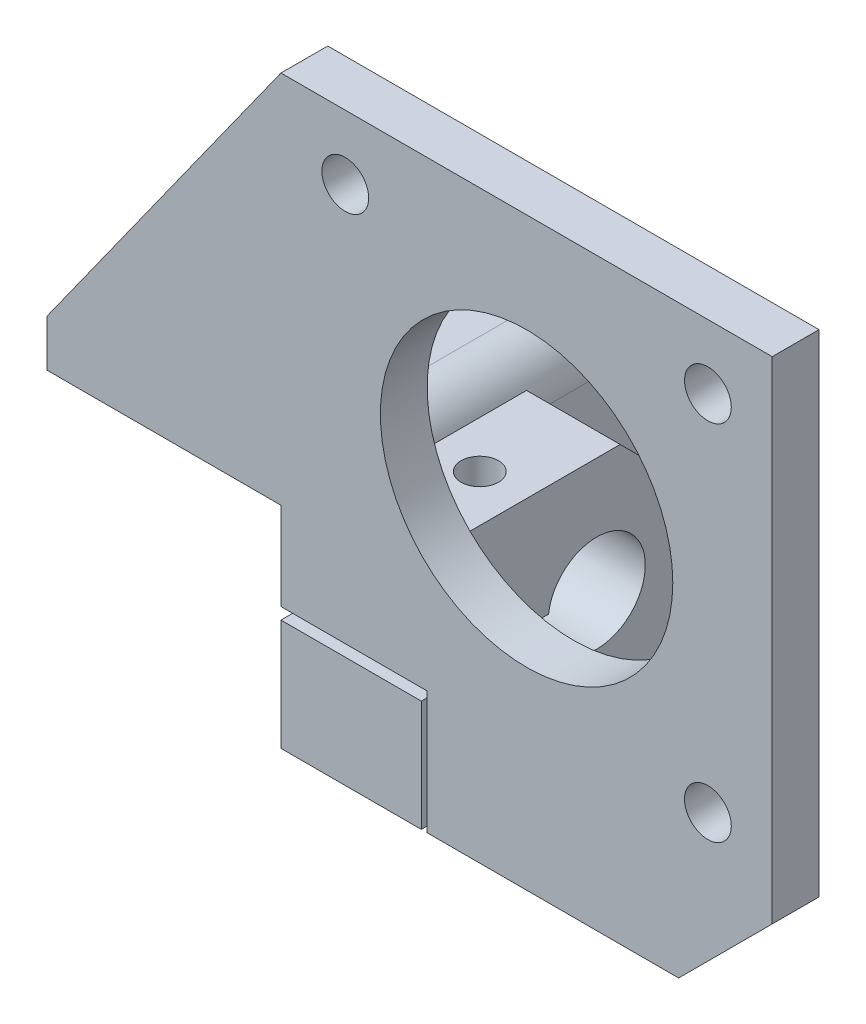
ISO-10303-21;
HEADER;
FILE_DESCRIPTION(('STEP AP214'),'2;1');
FILE_NAME('part.step','',(''),(''),'','','');
FILE_SCHEMA(('AUTOMOTIVE_DESIGN { 1 0 10303 214 1 1 1 1 }'));
ENDSEC;
DATA;
#1=APPLICATION_CONTEXT('core data for automotive mechanical design processes');
#2=APPLICATION_PROTOCOL_DEFINITION('international standard','automotive_design',2000,#1);
#3=PRODUCT_CONTEXT('',#1,'mechanical');
#4=PRODUCT('Part','Part','',(#3));
#5=PRODUCT_RELATED_PRODUCT_CATEGORY('part','',(#4));
#6=PRODUCT_DEFINITION_FORMATION('','',#4);
#7=PRODUCT_DEFINITION_CONTEXT('part definition',#1,'design');
#8=PRODUCT_DEFINITION('design','',#6,#7);
#9=PRODUCT_DEFINITION_SHAPE('','',#8);
#10=(LENGTH_UNIT() NAMED_UNIT(*) SI_UNIT(.MILLI.,.METRE.));
#11=(NAMED_UNIT(*) PLANE_ANGLE_UNIT() SI_UNIT($,.RADIAN.));
#12=(NAMED_UNIT(*) SI_UNIT($,.STERADIAN.) SOLID_ANGLE_UNIT());
#13=UNCERTAINTY_MEASURE_WITH_UNIT(LENGTH_MEASURE(1.E-05),#10,'distance_accuracy_value','');
#14=(GEOMETRIC_REPRESENTATION_CONTEXT(3) GLOBAL_UNCERTAINTY_ASSIGNED_CONTEXT((#13)) GLOBAL_UNIT_ASSIGNED_CONTEXT((#10,
#11,#12)) REPRESENTATION_CONTEXT('',''));
#15=CARTESIAN_POINT('',(0.,0.,0.));
#16=DIRECTION('',(0.,0.,1.));
#17=DIRECTION('',(1.,0.,0.));
#18=AXIS2_PLACEMENT_3D('',#15,#16,#17);
#19=CARTESIAN_POINT('',(0.,0.,0.));
#20=DIRECTION('',(0.,0.,-1.));
#21=DIRECTION('',(-1.,0.,0.));
#22=AXIS2_PLACEMENT_3D('',#19,#20,#21);
#23=PLANE('',#22);
#24=CARTESIAN_POINT('',(15.5,-15.5,0.));
#25=DIRECTION('',(0.,0.,1.));
#26=DIRECTION('',(1.,0.,0.));
#27=AXIS2_PLACEMENT_3D('',#24,#25,#26);
#28=CIRCLE('',#27,2.);
#29=CARTESIAN_POINT('',(17.5,-15.5,0.));
#30=VERTEX_POINT('',#29);
#31=EDGE_CURVE('E318',#30,#30,#28,.T.);
#32=ORIENTED_EDGE('',*,*,#31,.T.);
#33=EDGE_LOOP('',(#32));
#34=FACE_BOUND('',#33,.T.);
#35=CARTESIAN_POINT('',(-15.5,15.5,0.));
#36=DIRECTION('',(0.,0.,1.));
#37=DIRECTION('',(1.,0.,0.));
#38=AXIS2_PLACEMENT_3D('',#35,#36,#37);
#39=CIRCLE('',#38,2.);
#40=CARTESIAN_POINT('',(-13.5,15.5,0.));
#41=VERTEX_POINT('',#40);
#42=EDGE_CURVE('E330',#41,#41,#39,.T.);
#43=ORIENTED_EDGE('',*,*,#42,.T.);
#44=EDGE_LOOP('',(#43));
#45=FACE_BOUND('',#44,.T.);
#46=CARTESIAN_POINT('',(15.5,15.5,0.));
#47=DIRECTION('',(0.,0.,1.));
#48=DIRECTION('',(1.,0.,0.));
#49=AXIS2_PLACEMENT_3D('',#46,#47,#48);
#50=CIRCLE('',#49,2.);
#51=CARTESIAN_POINT('',(17.5,15.5,0.));
#52=VERTEX_POINT('',#51);
#53=EDGE_CURVE('E324',#52,#52,#50,.T.);
#54=ORIENTED_EDGE('',*,*,#53,.T.);
#55=EDGE_LOOP('',(#54));
#56=FACE_BOUND('',#55,.T.);
#57=CARTESIAN_POINT('',(0.,0.,0.));
#58=DIRECTION('',(0.,0.,1.));
#59=DIRECTION('',(1.,0.,0.));
#60=AXIS2_PLACEMENT_3D('',#57,#58,#59);
#61=CIRCLE('',#60,12.5);
#62=CARTESIAN_POINT('',(12.5,0.,0.));
#63=VERTEX_POINT('',#62);
#64=EDGE_CURVE('E314',#63,#63,#61,.T.);
#65=ORIENTED_EDGE('',*,*,#64,.T.);
#66=EDGE_LOOP('',(#65));
#67=FACE_BOUND('',#66,.T.);
#68=DIRECTION('',(1.,0.,0.));
#69=VECTOR('',#68,1.);
#70=CARTESIAN_POINT('',(-21.,-29.,0.));
#71=LINE('',#70,#69);
#72=CARTESIAN_POINT('',(-8.49999999999999,-29.,0.));
#73=VERTEX_POINT('',#72);
#74=CARTESIAN_POINT('',(13.,-29.,0.));
#75=VERTEX_POINT('',#74);
#76=EDGE_CURVE('E343',#73,#75,#71,.T.);
#77=ORIENTED_EDGE('',*,*,#76,.F.);
#78=DIRECTION('',(0.,1.,0.));
#79=VECTOR('',#78,1.);
#80=CARTESIAN_POINT('',(-8.49999999999998,0.,0.));
#81=LINE('',#80,#79);
#82=CARTESIAN_POINT('',(-8.49999999999999,-18.5,0.));
#83=VERTEX_POINT('',#82);
#84=EDGE_CURVE('E237',#73,#83,#81,.T.);
#85=ORIENTED_EDGE('',*,*,#84,.T.);
#86=DIRECTION('',(-1.,0.,0.));
#87=VECTOR('',#86,1.);
#88=CARTESIAN_POINT('',(0.,-18.5,0.));
#89=LINE('',#88,#87);
#90=CARTESIAN_POINT('',(-8.99999999999999,-18.5,0.));
#91=VERTEX_POINT('',#90);
#92=EDGE_CURVE('E221',#83,#91,#89,.T.);
#93=ORIENTED_EDGE('',*,*,#92,.T.);
#94=DIRECTION('',(0.,-1.,0.));
#95=VECTOR('',#94,1.);
#96=CARTESIAN_POINT('',(-8.99999999999999,-29.,0.));
#97=LINE('',#96,#95);
#98=CARTESIAN_POINT('',(-8.99999999999998,-9.00000000000001,0.));
#99=VERTEX_POINT('',#98);
#100=EDGE_CURVE('E57',#99,#91,#97,.T.);
#101=ORIENTED_EDGE('',*,*,#100,.F.);
#102=DIRECTION('',(-1.,0.,0.));
#103=VECTOR('',#102,1.);
#104=CARTESIAN_POINT('',(-8.99999999999998,-9.00000000000001,0.));
#105=LINE('',#104,#103);
#106=CARTESIAN_POINT('',(-17.,-9.00000000000001,0.));
#107=VERTEX_POINT('',#106);
#108=EDGE_CURVE('E52',#99,#107,#105,.T.);
#109=ORIENTED_EDGE('',*,*,#108,.T.);
#110=DIRECTION('',(0.,-1.,0.));
#111=VECTOR('',#110,1.);
#112=CARTESIAN_POINT('',(-17.,-29.,0.));
#113=LINE('',#112,#111);
#114=CARTESIAN_POINT('',(-17.,-11.,0.));
#115=VERTEX_POINT('',#114);
#116=EDGE_CURVE('E241',#107,#115,#113,.T.);
#117=ORIENTED_EDGE('',*,*,#116,.T.);
#118=CARTESIAN_POINT('',(-21.,-11.,0.));
#119=DIRECTION('',(0.,0.,-1.));
#120=DIRECTION('',(-1.,0.,0.));
#121=AXIS2_PLACEMENT_3D('',#118,#119,#120);
#122=CIRCLE('',#121,4.);
#123=CARTESIAN_POINT('',(-21.,-7.00000000000001,0.));
#124=VERTEX_POINT('',#123);
#125=EDGE_CURVE('E284',#124,#115,#122,.T.);
#126=ORIENTED_EDGE('',*,*,#125,.F.);
#127=DIRECTION('',(1.,0.,0.));
#128=VECTOR('',#127,1.);
#129=CARTESIAN_POINT('',(-41.,-7.00000000000001,0.));
#130=LINE('',#129,#128);
#131=CARTESIAN_POINT('',(-41.,-7.00000000000001,0.));
#132=VERTEX_POINT('',#131);
#133=EDGE_CURVE('E279',#132,#124,#130,.T.);
#134=ORIENTED_EDGE('',*,*,#133,.F.);
#135=DIRECTION('',(-0.581238193719096,-0.813733471206735,0.));
#136=VECTOR('',#135,1.);
#137=CARTESIAN_POINT('',(-41.,-7.00000000000001,0.));
#138=LINE('',#137,#136);
#139=CARTESIAN_POINT('',(-21.,21.,0.));
#140=VERTEX_POINT('',#139);
#141=EDGE_CURVE('E367',#140,#132,#138,.T.);
#142=ORIENTED_EDGE('',*,*,#141,.F.);
#143=DIRECTION('',(-1.,0.,0.));
#144=VECTOR('',#143,1.);
#145=CARTESIAN_POINT('',(-21.,21.,0.));
#146=LINE('',#145,#144);
#147=CARTESIAN_POINT('',(21.,21.,0.));
#148=VERTEX_POINT('',#147);
#149=EDGE_CURVE('E365',#148,#140,#146,.T.);
#150=ORIENTED_EDGE('',*,*,#149,.F.);
#151=DIRECTION('',(0.,1.,0.));
#152=VECTOR('',#151,1.);
#153=CARTESIAN_POINT('',(21.,21.,0.));
#154=LINE('',#153,#152);
#155=CARTESIAN_POINT('',(21.,-21.,0.));
#156=VERTEX_POINT('',#155);
#157=EDGE_CURVE('E363',#156,#148,#154,.T.);
#158=ORIENTED_EDGE('',*,*,#157,.F.);
#159=DIRECTION('',(0.707106781186546,0.707106781186549,0.));
#160=VECTOR('',#159,1.);
#161=CARTESIAN_POINT('',(13.,-29.,0.));
#162=LINE('',#161,#160);
#163=EDGE_CURVE('E336',#75,#156,#162,.T.);
#164=ORIENTED_EDGE('',*,*,#163,.F.);
#165=EDGE_LOOP('',(#77,#85,#93,#101,#109,#117,#126,#134,#142,#150,#158,#164));
#166=FACE_BOUND('',#165,.T.);
#167=ADVANCED_FACE('F35',(#34,#45,#56,#67,#166),#23,.T.);
#168=CARTESIAN_POINT('',(0.,0.,4.));
#169=DIRECTION('',(0.,0.,-1.));
#170=DIRECTION('',(-1.,0.,0.));
#171=AXIS2_PLACEMENT_3D('',#168,#169,#170);
#172=PLANE('',#171);
#173=DIRECTION('',(0.,-1.,0.));
#174=VECTOR('',#173,1.);
#175=CARTESIAN_POINT('',(-8.99999999999998,0.,4.));
#176=LINE('',#175,#174);
#177=CARTESIAN_POINT('',(-8.99999999999999,-19.5,4.));
#178=VERTEX_POINT('',#177);
#179=CARTESIAN_POINT('',(-8.99999999999999,-29.,4.));
#180=VERTEX_POINT('',#179);
#181=EDGE_CURVE('E232',#178,#180,#176,.T.);
#182=ORIENTED_EDGE('',*,*,#181,.F.);
#183=DIRECTION('',(1.,0.,0.));
#184=VECTOR('',#183,1.);
#185=CARTESIAN_POINT('',(0.,-19.5,4.));
#186=LINE('',#185,#184);
#187=CARTESIAN_POINT('',(-21.,-19.5,4.));
#188=VERTEX_POINT('',#187);
#189=EDGE_CURVE('E229',#188,#178,#186,.T.);
#190=ORIENTED_EDGE('',*,*,#189,.F.);
#191=DIRECTION('',(0.,-1.,0.));
#192=VECTOR('',#191,1.);
#193=CARTESIAN_POINT('',(-21.,-11.,4.));
#194=LINE('',#193,#192);
#195=CARTESIAN_POINT('',(-21.,-29.,4.));
#196=VERTEX_POINT('',#195);
#197=EDGE_CURVE('E353',#188,#196,#194,.T.);
#198=ORIENTED_EDGE('',*,*,#197,.T.);
#199=DIRECTION('',(1.,0.,0.));
#200=VECTOR('',#199,1.);
#201=CARTESIAN_POINT('',(-21.,-29.,4.));
#202=LINE('',#201,#200);
#203=EDGE_CURVE('E357',#196,#180,#202,.T.);
#204=ORIENTED_EDGE('',*,*,#203,.T.);
#205=EDGE_LOOP('',(#182,#190,#198,#204));
#206=FACE_BOUND('',#205,.T.);
#207=ADVANCED_FACE('F494',(#206),#172,.F.);
#208=CARTESIAN_POINT('',(0.,0.,4.));
#209=DIRECTION('',(0.,0.,1.));
#210=DIRECTION('',(1.,0.,0.));
#211=AXIS2_PLACEMENT_3D('',#208,#209,#210);
#212=CIRCLE('',#211,12.5);
#213=CARTESIAN_POINT('',(12.5,0.,4.));
#214=VERTEX_POINT('',#213);
#215=EDGE_CURVE('E315',#214,#214,#212,.T.);
#216=ORIENTED_EDGE('',*,*,#215,.F.);
#217=EDGE_LOOP('',(#216));
#218=FACE_BOUND('',#217,.T.);
#219=CARTESIAN_POINT('',(15.5,-15.5,4.));
#220=DIRECTION('',(0.,0.,1.));
#221=DIRECTION('',(1.,0.,0.));
#222=AXIS2_PLACEMENT_3D('',#219,#220,#221);
#223=CIRCLE('',#222,2.);
#224=CARTESIAN_POINT('',(17.5,-15.5,4.));
#225=VERTEX_POINT('',#224);
#226=EDGE_CURVE('E321',#225,#225,#223,.T.);
#227=ORIENTED_EDGE('',*,*,#226,.F.);
#228=EDGE_LOOP('',(#227));
#229=FACE_BOUND('',#228,.T.);
#230=CARTESIAN_POINT('',(15.5,15.5,4.));
#231=DIRECTION('',(0.,0.,1.));
#232=DIRECTION('',(1.,0.,0.));
#233=AXIS2_PLACEMENT_3D('',#230,#231,#232);
#234=CIRCLE('',#233,2.);
#235=CARTESIAN_POINT('',(17.5,15.5,4.));
#236=VERTEX_POINT('',#235);
#237=EDGE_CURVE('E327',#236,#236,#234,.T.);
#238=ORIENTED_EDGE('',*,*,#237,.F.);
#239=EDGE_LOOP('',(#238));
#240=FACE_BOUND('',#239,.T.);
#241=CARTESIAN_POINT('',(-15.5,15.5,4.));
#242=DIRECTION('',(0.,0.,1.));
#243=DIRECTION('',(1.,0.,0.));
#244=AXIS2_PLACEMENT_3D('',#241,#242,#243);
#245=CIRCLE('',#244,2.);
#246=CARTESIAN_POINT('',(-13.5,15.5,4.));
#247=VERTEX_POINT('',#246);
#248=EDGE_CURVE('E333',#247,#247,#245,.T.);
#249=ORIENTED_EDGE('',*,*,#248,.F.);
#250=EDGE_LOOP('',(#249));
#251=FACE_BOUND('',#250,.T.);
#252=DIRECTION('',(0.,1.,0.));
#253=VECTOR('',#252,1.);
#254=CARTESIAN_POINT('',(-8.49999999999998,0.,4.));
#255=LINE('',#254,#253);
#256=CARTESIAN_POINT('',(-8.49999999999999,-29.,4.));
#257=VERTEX_POINT('',#256);
#258=CARTESIAN_POINT('',(-8.49999999999999,-18.5,4.));
#259=VERTEX_POINT('',#258);
#260=EDGE_CURVE('E235',#257,#259,#255,.T.);
#261=ORIENTED_EDGE('',*,*,#260,.F.);
#262=CARTESIAN_POINT('',(13.,-29.,4.));
#263=VERTEX_POINT('',#262);
#264=EDGE_CURVE('E356',#257,#263,#202,.T.);
#265=ORIENTED_EDGE('',*,*,#264,.T.);
#266=DIRECTION('',(0.707106781186546,0.707106781186549,0.));
#267=VECTOR('',#266,1.);
#268=CARTESIAN_POINT('',(13.,-29.,4.));
#269=LINE('',#268,#267);
#270=CARTESIAN_POINT('',(21.,-21.,4.));
#271=VERTEX_POINT('',#270);
#272=EDGE_CURVE('E339',#263,#271,#269,.T.);
#273=ORIENTED_EDGE('',*,*,#272,.T.);
#274=DIRECTION('',(0.,1.,0.));
#275=VECTOR('',#274,1.);
#276=CARTESIAN_POINT('',(21.,21.,4.));
#277=LINE('',#276,#275);
#278=CARTESIAN_POINT('',(21.,21.,4.));
#279=VERTEX_POINT('',#278);
#280=EDGE_CURVE('E342',#271,#279,#277,.T.);
#281=ORIENTED_EDGE('',*,*,#280,.T.);
#282=DIRECTION('',(-1.,0.,0.));
#283=VECTOR('',#282,1.);
#284=CARTESIAN_POINT('',(-21.,21.,4.));
#285=LINE('',#284,#283);
#286=CARTESIAN_POINT('',(-21.,21.,4.));
#287=VERTEX_POINT('',#286);
#288=EDGE_CURVE('E345',#279,#287,#285,.T.);
#289=ORIENTED_EDGE('',*,*,#288,.T.);
#290=DIRECTION('',(-0.581238193719096,-0.813733471206735,0.));
#291=VECTOR('',#290,1.);
#292=CARTESIAN_POINT('',(-41.,-7.00000000000001,4.));
#293=LINE('',#292,#291);
#294=CARTESIAN_POINT('',(-41.,-7.00000000000001,4.));
#295=VERTEX_POINT('',#294);
#296=EDGE_CURVE('E347',#287,#295,#293,.T.);
#297=ORIENTED_EDGE('',*,*,#296,.T.);
#298=DIRECTION('',(0.,-1.,0.));
#299=VECTOR('',#298,1.);
#300=CARTESIAN_POINT('',(-41.,-11.,4.));
#301=LINE('',#300,#299);
#302=CARTESIAN_POINT('',(-41.,-11.,4.));
#303=VERTEX_POINT('',#302);
#304=EDGE_CURVE('E349',#295,#303,#301,.T.);
#305=ORIENTED_EDGE('',*,*,#304,.T.);
#306=DIRECTION('',(1.,0.,0.));
#307=VECTOR('',#306,1.);
#308=CARTESIAN_POINT('',(-21.,-11.,4.));
#309=LINE('',#308,#307);
#310=CARTESIAN_POINT('',(-21.,-11.,4.));
#311=VERTEX_POINT('',#310);
#312=EDGE_CURVE('E351',#303,#311,#309,.T.);
#313=ORIENTED_EDGE('',*,*,#312,.T.);
#314=CARTESIAN_POINT('',(-21.,-18.5,4.));
#315=VERTEX_POINT('',#314);
#316=EDGE_CURVE('E354',#311,#315,#194,.T.);
#317=ORIENTED_EDGE('',*,*,#316,.T.);
#318=DIRECTION('',(-1.,0.,0.));
#319=VECTOR('',#318,1.);
#320=CARTESIAN_POINT('',(0.,-18.5,4.));
#321=LINE('',#320,#319);
#322=EDGE_CURVE('E220',#259,#315,#321,.T.);
#323=ORIENTED_EDGE('',*,*,#322,.F.);
#324=EDGE_LOOP('',(#261,#265,#273,#281,#289,#297,#305,#313,#317,#323));
#325=FACE_BOUND('',#324,.T.);
#326=ADVANCED_FACE('F456',(#218,#229,#240,#251,#325),#172,.F.);
#327=CARTESIAN_POINT('',(-21.,-21.,4.));
#328=DIRECTION('',(1.,0.,0.));
#329=DIRECTION('',(0.,1.,0.));
#330=AXIS2_PLACEMENT_3D('',#327,#328,#329);
#331=PLANE('',#330);
#332=CARTESIAN_POINT('',(-21.,-21.,-21.));
#333=DIRECTION('',(1.,0.,0.));
#334=DIRECTION('',(0.,1.,0.));
#335=AXIS2_PLACEMENT_3D('',#332,#333,#334);
#336=CIRCLE('',#335,1.75);
#337=CARTESIAN_POINT('',(-21.,-19.25,-21.));
#338=VERTEX_POINT('',#337);
#339=EDGE_CURVE('E408',#338,#338,#336,.T.);
#340=ORIENTED_EDGE('',*,*,#339,.T.);
#341=EDGE_LOOP('',(#340));
#342=FACE_BOUND('',#341,.T.);
#343=DIRECTION('',(0.,0.,1.));
#344=VECTOR('',#343,1.);
#345=CARTESIAN_POINT('',(-21.,-19.5,-8.));
#346=LINE('',#345,#344);
#347=CARTESIAN_POINT('',(-21.,-19.5,-6.8802305889771));
#348=VERTEX_POINT('',#347);
#349=EDGE_CURVE('E213',#348,#188,#346,.T.);
#350=ORIENTED_EDGE('',*,*,#349,.F.);
#351=CARTESIAN_POINT('',(-21.,-19.,-11.));
#352=DIRECTION('',(1.,0.,0.));
#353=DIRECTION('',(0.,1.,0.));
#354=AXIS2_PLACEMENT_3D('',#351,#352,#353);
#355=CIRCLE('',#354,4.15);
#356=CARTESIAN_POINT('',(-21.,-18.5,-6.8802305889771));
#357=VERTEX_POINT('',#356);
#358=EDGE_CURVE('E196',#348,#357,#355,.T.);
#359=ORIENTED_EDGE('',*,*,#358,.T.);
#360=DIRECTION('',(0.,0.,-1.));
#361=VECTOR('',#360,1.);
#362=CARTESIAN_POINT('',(-21.,-18.5,4.));
#363=LINE('',#362,#361);
#364=EDGE_CURVE('E210',#315,#357,#363,.T.);
#365=ORIENTED_EDGE('',*,*,#364,.F.);
#366=ORIENTED_EDGE('',*,*,#316,.F.);
#367=DIRECTION('',(0.,0.,-1.));
#368=VECTOR('',#367,1.);
#369=CARTESIAN_POINT('',(-21.,-11.,4.));
#370=LINE('',#369,#368);
#371=CARTESIAN_POINT('',(-21.,-11.,-25.));
#372=VERTEX_POINT('',#371);
#373=EDGE_CURVE('E375',#311,#372,#370,.T.);
#374=ORIENTED_EDGE('',*,*,#373,.T.);
#375=DIRECTION('',(0.,1.,0.));
#376=VECTOR('',#375,1.);
#377=CARTESIAN_POINT('',(-21.,-29.,-25.));
#378=LINE('',#377,#376);
#379=CARTESIAN_POINT('',(-21.,-29.,-25.));
#380=VERTEX_POINT('',#379);
#381=EDGE_CURVE('E295',#380,#372,#378,.T.);
#382=ORIENTED_EDGE('',*,*,#381,.F.);
#383=DIRECTION('',(0.,0.,-1.));
#384=VECTOR('',#383,1.);
#385=CARTESIAN_POINT('',(-21.,-29.,4.));
#386=LINE('',#385,#384);
#387=EDGE_CURVE('E373',#196,#380,#386,.T.);
#388=ORIENTED_EDGE('',*,*,#387,.F.);
#389=ORIENTED_EDGE('',*,*,#197,.F.);
#390=EDGE_LOOP('',(#350,#359,#365,#366,#374,#382,#388,#389));
#391=FACE_BOUND('',#390,.T.);
#392=ADVANCED_FACE('F208',(#342,#391),#331,.F.);
#393=CARTESIAN_POINT('',(-21.,-29.,4.));
#394=DIRECTION('',(0.,1.,0.));
#395=DIRECTION('',(-1.,0.,0.));
#396=AXIS2_PLACEMENT_3D('',#393,#394,#395);
#397=PLANE('',#396);
#398=DIRECTION('',(0.,0.,1.));
#399=VECTOR('',#398,1.);
#400=CARTESIAN_POINT('',(-8.49999999999999,-29.,-8.));
#401=LINE('',#400,#399);
#402=EDGE_CURVE('E204',#73,#257,#401,.T.);
#403=ORIENTED_EDGE('',*,*,#402,.F.);
#404=ORIENTED_EDGE('',*,*,#76,.T.);
#405=DIRECTION('',(0.,0.,-1.));
#406=VECTOR('',#405,1.);
#407=CARTESIAN_POINT('',(13.,-29.,4.));
#408=LINE('',#407,#406);
#409=EDGE_CURVE('E360',#263,#75,#408,.T.);
#410=ORIENTED_EDGE('',*,*,#409,.F.);
#411=ORIENTED_EDGE('',*,*,#264,.F.);
#412=EDGE_LOOP('',(#403,#404,#410,#411));
#413=FACE_BOUND('',#412,.T.);
#414=ADVANCED_FACE('F472',(#413),#397,.F.);
#415=CARTESIAN_POINT('',(-13.,-29.,-5.));
#416=DIRECTION('',(0.,-1.,0.));
#417=DIRECTION('',(0.,0.,-1.));
#418=AXIS2_PLACEMENT_3D('',#415,#416,#417);
#419=CIRCLE('',#418,1.6);
#420=CARTESIAN_POINT('',(-13.,-29.,-6.6));
#421=VERTEX_POINT('',#420);
#422=EDGE_CURVE('E871',#421,#421,#419,.T.);
#423=ORIENTED_EDGE('',*,*,#422,.F.);
#424=EDGE_LOOP('',(#423));
#425=FACE_BOUND('',#424,.T.);
#426=DIRECTION('',(0.,0.,-1.));
#427=VECTOR('',#426,1.);
#428=CARTESIAN_POINT('',(-8.99999999999999,-29.,-13.));
#429=LINE('',#428,#427);
#430=CARTESIAN_POINT('',(-8.99999999999999,-29.,-13.));
#431=VERTEX_POINT('',#430);
#432=EDGE_CURVE('E243',#180,#431,#429,.T.);
#433=ORIENTED_EDGE('',*,*,#432,.F.);
#434=ORIENTED_EDGE('',*,*,#203,.F.);
#435=ORIENTED_EDGE('',*,*,#387,.T.);
#436=DIRECTION('',(-1.,0.,0.));
#437=VECTOR('',#436,1.);
#438=CARTESIAN_POINT('',(-17.,-29.,-25.));
#439=LINE('',#438,#437);
#440=CARTESIAN_POINT('',(-17.,-29.,-25.));
#441=VERTEX_POINT('',#440);
#442=EDGE_CURVE('E292',#441,#380,#439,.T.);
#443=ORIENTED_EDGE('',*,*,#442,.F.);
#444=DIRECTION('',(0.,0.,1.));
#445=VECTOR('',#444,1.);
#446=CARTESIAN_POINT('',(-17.,-29.,-25.));
#447=LINE('',#446,#445);
#448=CARTESIAN_POINT('',(-17.,-29.,-13.));
#449=VERTEX_POINT('',#448);
#450=EDGE_CURVE('E298',#441,#449,#447,.T.);
#451=ORIENTED_EDGE('',*,*,#450,.T.);
#452=DIRECTION('',(-1.,0.,0.));
#453=VECTOR('',#452,1.);
#454=CARTESIAN_POINT('',(-8.99999999999999,-29.,-13.));
#455=LINE('',#454,#453);
#456=EDGE_CURVE('E276',#431,#449,#455,.T.);
#457=ORIENTED_EDGE('',*,*,#456,.F.);
#458=EDGE_LOOP('',(#433,#434,#435,#443,#451,#457));
#459=FACE_BOUND('',#458,.T.);
#460=ADVANCED_FACE('F489',(#425,#459),#397,.F.);
#461=CARTESIAN_POINT('',(-8.99999999999998,0.,0.));
#462=DIRECTION('',(-1.,0.,0.));
#463=DIRECTION('',(0.,-1.,0.));
#464=AXIS2_PLACEMENT_3D('',#461,#462,#463);
#465=PLANE('',#464);
#466=DIRECTION('',(0.,0.,1.));
#467=VECTOR('',#466,1.);
#468=CARTESIAN_POINT('',(-8.99999999999999,-18.5,0.));
#469=LINE('',#468,#467);
#470=CARTESIAN_POINT('',(-8.99999999999999,-18.5,-6.88023058897709));
#471=VERTEX_POINT('',#470);
#472=EDGE_CURVE('E203',#471,#91,#469,.T.);
#473=ORIENTED_EDGE('',*,*,#472,.F.);
#474=CARTESIAN_POINT('',(-8.99999999999999,-19.,-11.));
#475=DIRECTION('',(1.,0.,0.));
#476=DIRECTION('',(0.,1.,0.));
#477=AXIS2_PLACEMENT_3D('',#474,#475,#476);
#478=CIRCLE('',#477,4.15);
#479=CARTESIAN_POINT('',(-8.99999999999999,-19.5,-6.8802305889771));
#480=VERTEX_POINT('',#479);
#481=EDGE_CURVE('E199',#480,#471,#478,.T.);
#482=ORIENTED_EDGE('',*,*,#481,.F.);
#483=DIRECTION('',(0.,0.,1.));
#484=VECTOR('',#483,1.);
#485=CARTESIAN_POINT('',(-8.99999999999999,-19.5,-8.));
#486=LINE('',#485,#484);
#487=EDGE_CURVE('E414',#480,#178,#486,.T.);
#488=ORIENTED_EDGE('',*,*,#487,.T.);
#489=ORIENTED_EDGE('',*,*,#181,.T.);
#490=ORIENTED_EDGE('',*,*,#432,.T.);
#491=DIRECTION('',(0.,0.707106781186548,-0.707106781186548));
#492=VECTOR('',#491,1.);
#493=CARTESIAN_POINT('',(-8.99999999999999,-24.,-18.));
#494=LINE('',#493,#492);
#495=CARTESIAN_POINT('',(-8.99999999999999,-24.,-18.));
#496=VERTEX_POINT('',#495);
#497=EDGE_CURVE('E246',#431,#496,#494,.T.);
#498=ORIENTED_EDGE('',*,*,#497,.T.);
#499=DIRECTION('',(0.,1.,0.));
#500=VECTOR('',#499,1.);
#501=CARTESIAN_POINT('',(-8.99999999999999,-14.,-18.));
#502=LINE('',#501,#500);
#503=CARTESIAN_POINT('',(-8.99999999999999,-14.,-18.));
#504=VERTEX_POINT('',#503);
#505=EDGE_CURVE('E248',#496,#504,#502,.T.);
#506=ORIENTED_EDGE('',*,*,#505,.T.);
#507=DIRECTION('',(0.,0.707106781186547,0.707106781186548));
#508=VECTOR('',#507,1.);
#509=CARTESIAN_POINT('',(-8.99999999999998,-9.00000000000001,-13.));
#510=LINE('',#509,#508);
#511=CARTESIAN_POINT('',(-8.99999999999998,-9.00000000000001,-13.));
#512=VERTEX_POINT('',#511);
#513=EDGE_CURVE('E250',#504,#512,#510,.T.);
#514=ORIENTED_EDGE('',*,*,#513,.T.);
#515=DIRECTION('',(0.,0.,1.));
#516=VECTOR('',#515,1.);
#517=CARTESIAN_POINT('',(-8.99999999999998,-9.00000000000001,0.));
#518=LINE('',#517,#516);
#519=EDGE_CURVE('E252',#512,#99,#518,.T.);
#520=ORIENTED_EDGE('',*,*,#519,.T.);
#521=ORIENTED_EDGE('',*,*,#100,.T.);
#522=EDGE_LOOP('',(#473,#482,#488,#489,#490,#498,#506,#514,#520,#521));
#523=FACE_BOUND('',#522,.T.);
#524=ADVANCED_FACE('F419',(#523),#465,.F.);
#525=CARTESIAN_POINT('',(-8.99999999999999,-19.,-11.));
#526=DIRECTION('',(-1.,0.,0.));
#527=DIRECTION('',(0.,-1.,0.));
#528=AXIS2_PLACEMENT_3D('',#525,#526,#527);
#529=CYLINDRICAL_SURFACE('',#528,4.15);
#530=DIRECTION('',(-1.,0.,0.));
#531=VECTOR('',#530,1.);
#532=CARTESIAN_POINT('',(-8.99999999999999,-18.5,-6.88023058897709));
#533=LINE('',#532,#531);
#534=EDGE_CURVE('E192',#471,#357,#533,.T.);
#535=ORIENTED_EDGE('',*,*,#534,.T.);
#536=ORIENTED_EDGE('',*,*,#358,.F.);
#537=DIRECTION('',(-1.,0.,0.));
#538=VECTOR('',#537,1.);
#539=CARTESIAN_POINT('',(-8.99999999999999,-19.5,-6.8802305889771));
#540=LINE('',#539,#538);
#541=EDGE_CURVE('E223',#348,#480,#540,.F.);
#542=ORIENTED_EDGE('',*,*,#541,.T.);
#543=ORIENTED_EDGE('',*,*,#481,.T.);
#544=EDGE_LOOP('',(#535,#536,#542,#543));
#545=FACE_BOUND('',#544,.T.);
#546=ADVANCED_FACE('F194',(#545),#529,.F.);
#547=CARTESIAN_POINT('',(13.,-29.,4.));
#548=DIRECTION('',(-0.707106781186549,0.707106781186546,0.));
#549=DIRECTION('',(-0.707106781186546,-0.707106781186549,0.));
#550=AXIS2_PLACEMENT_3D('',#547,#548,#549);
#551=PLANE('',#550);
#552=ORIENTED_EDGE('',*,*,#163,.T.);
#553=DIRECTION('',(0.,0.,-1.));
#554=VECTOR('',#553,1.);
#555=CARTESIAN_POINT('',(21.,-21.,4.));
#556=LINE('',#555,#554);
#557=EDGE_CURVE('E11',#271,#156,#556,.T.);
#558=ORIENTED_EDGE('',*,*,#557,.F.);
#559=ORIENTED_EDGE('',*,*,#272,.F.);
#560=ORIENTED_EDGE('',*,*,#409,.T.);
#561=EDGE_LOOP('',(#552,#558,#559,#560));
#562=FACE_BOUND('',#561,.T.);
#563=ADVANCED_FACE('F37',(#562),#551,.F.);
#564=CARTESIAN_POINT('',(21.,21.,4.));
#565=DIRECTION('',(-1.,0.,0.));
#566=DIRECTION('',(0.,-1.,0.));
#567=AXIS2_PLACEMENT_3D('',#564,#565,#566);
#568=PLANE('',#567);
#569=ORIENTED_EDGE('',*,*,#157,.T.);
#570=DIRECTION('',(0.,0.,-1.));
#571=VECTOR('',#570,1.);
#572=CARTESIAN_POINT('',(21.,21.,4.));
#573=LINE('',#572,#571);
#574=EDGE_CURVE('E44',#279,#148,#573,.T.);
#575=ORIENTED_EDGE('',*,*,#574,.F.);
#576=ORIENTED_EDGE('',*,*,#280,.F.);
#577=ORIENTED_EDGE('',*,*,#557,.T.);
#578=EDGE_LOOP('',(#569,#575,#576,#577));
#579=FACE_BOUND('',#578,.T.);
#580=ADVANCED_FACE('F465',(#579),#568,.F.);
#581=CARTESIAN_POINT('',(-21.,21.,4.));
#582=DIRECTION('',(0.,-1.,0.));
#583=DIRECTION('',(0.,0.,-1.));
#584=AXIS2_PLACEMENT_3D('',#581,#582,#583);
#585=PLANE('',#584);
#586=ORIENTED_EDGE('',*,*,#149,.T.);
#587=DIRECTION('',(0.,0.,-1.));
#588=VECTOR('',#587,1.);
#589=CARTESIAN_POINT('',(-21.,21.,4.));
#590=LINE('',#589,#588);
#591=EDGE_CURVE('E382',#287,#140,#590,.T.);
#592=ORIENTED_EDGE('',*,*,#591,.F.);
#593=ORIENTED_EDGE('',*,*,#288,.F.);
#594=ORIENTED_EDGE('',*,*,#574,.T.);
#595=EDGE_LOOP('',(#586,#592,#593,#594));
#596=FACE_BOUND('',#595,.T.);
#597=ADVANCED_FACE('F461',(#596),#585,.F.);
#598=CARTESIAN_POINT('',(-41.,-7.00000000000001,4.));
#599=DIRECTION('',(0.813733471206735,-0.581238193719096,0.));
#600=DIRECTION('',(0.581238193719096,0.813733471206735,0.));
#601=AXIS2_PLACEMENT_3D('',#598,#599,#600);
#602=PLANE('',#601);
#603=ORIENTED_EDGE('',*,*,#141,.T.);
#604=DIRECTION('',(0.,0.,-1.));
#605=VECTOR('',#604,1.);
#606=CARTESIAN_POINT('',(-41.,-7.00000000000001,4.));
#607=LINE('',#606,#605);
#608=EDGE_CURVE('E379',#295,#132,#607,.T.);
#609=ORIENTED_EDGE('',*,*,#608,.F.);
#610=ORIENTED_EDGE('',*,*,#296,.F.);
#611=ORIENTED_EDGE('',*,*,#591,.T.);
#612=EDGE_LOOP('',(#603,#609,#610,#611));
#613=FACE_BOUND('',#612,.T.);
#614=ADVANCED_FACE('F445',(#613),#602,.F.);
#615=CARTESIAN_POINT('',(-41.,-11.,4.));
#616=DIRECTION('',(1.,0.,0.));
#617=DIRECTION('',(0.,1.,0.));
#618=AXIS2_PLACEMENT_3D('',#615,#616,#617);
#619=PLANE('',#618);
#620=ORIENTED_EDGE('',*,*,#608,.T.);
#621=DIRECTION('',(0.,0.,1.));
#622=VECTOR('',#621,1.);
#623=CARTESIAN_POINT('',(-41.,-7.00000000000001,-25.));
#624=LINE('',#623,#622);
#625=CARTESIAN_POINT('',(-41.,-7.00000000000001,-25.));
#626=VERTEX_POINT('',#625);
#627=EDGE_CURVE('E311',#626,#132,#624,.T.);
#628=ORIENTED_EDGE('',*,*,#627,.F.);
#629=DIRECTION('',(0.,1.,0.));
#630=VECTOR('',#629,1.);
#631=CARTESIAN_POINT('',(-41.,-11.,-25.));
#632=LINE('',#631,#630);
#633=CARTESIAN_POINT('',(-41.,-11.,-25.));
#634=VERTEX_POINT('',#633);
#635=EDGE_CURVE('E283',#634,#626,#632,.T.);
#636=ORIENTED_EDGE('',*,*,#635,.F.);
#637=DIRECTION('',(0.,0.,-1.));
#638=VECTOR('',#637,1.);
#639=CARTESIAN_POINT('',(-41.,-11.,4.));
#640=LINE('',#639,#638);
#641=EDGE_CURVE('E377',#303,#634,#640,.T.);
#642=ORIENTED_EDGE('',*,*,#641,.F.);
#643=ORIENTED_EDGE('',*,*,#304,.F.);
#644=EDGE_LOOP('',(#620,#628,#636,#642,#643));
#645=FACE_BOUND('',#644,.T.);
#646=ADVANCED_FACE('F450',(#645),#619,.F.);
#647=CARTESIAN_POINT('',(-21.,-11.,4.));
#648=DIRECTION('',(0.,1.,0.));
#649=DIRECTION('',(-1.,0.,0.));
#650=AXIS2_PLACEMENT_3D('',#647,#648,#649);
#651=PLANE('',#650);
#652=CARTESIAN_POINT('',(-31.5,-11.,2.));
#653=DIRECTION('',(0.,1.,0.));
#654=DIRECTION('',(-1.,0.,0.));
#655=AXIS2_PLACEMENT_3D('',#652,#653,#654);
#656=CIRCLE('',#655,1.75);
#657=CARTESIAN_POINT('',(-33.25,-11.,2.));
#658=VERTEX_POINT('',#657);
#659=EDGE_CURVE('E386',#658,#658,#656,.T.);
#660=ORIENTED_EDGE('',*,*,#659,.T.);
#661=EDGE_LOOP('',(#660));
#662=FACE_BOUND('',#661,.T.);
#663=CARTESIAN_POINT('',(-31.5,-11.,-18.));
#664=DIRECTION('',(0.,1.,0.));
#665=DIRECTION('',(-1.,0.,0.));
#666=AXIS2_PLACEMENT_3D('',#663,#664,#665);
#667=CIRCLE('',#666,1.75);
#668=CARTESIAN_POINT('',(-33.25,-11.,-18.));
#669=VERTEX_POINT('',#668);
#670=EDGE_CURVE('E215',#669,#669,#667,.T.);
#671=ORIENTED_EDGE('',*,*,#670,.T.);
#672=EDGE_LOOP('',(#671));
#673=FACE_BOUND('',#672,.T.);
#674=ORIENTED_EDGE('',*,*,#641,.T.);
#675=DIRECTION('',(-1.,0.,0.));
#676=VECTOR('',#675,1.);
#677=CARTESIAN_POINT('',(-21.,-11.,-25.));
#678=LINE('',#677,#676);
#679=EDGE_CURVE('E280',#372,#634,#678,.T.);
#680=ORIENTED_EDGE('',*,*,#679,.F.);
#681=ORIENTED_EDGE('',*,*,#373,.F.);
#682=ORIENTED_EDGE('',*,*,#312,.F.);
#683=EDGE_LOOP('',(#674,#680,#681,#682));
#684=FACE_BOUND('',#683,.T.);
#685=ADVANCED_FACE('F482',(#662,#673,#684),#651,.F.);
#686=CARTESIAN_POINT('',(-15.5,15.5,4.));
#687=DIRECTION('',(0.,0.,-1.));
#688=DIRECTION('',(-1.,0.,0.));
#689=AXIS2_PLACEMENT_3D('',#686,#687,#688);
#690=CYLINDRICAL_SURFACE('',#689,2.);
#691=ORIENTED_EDGE('',*,*,#248,.T.);
#692=EDGE_LOOP('',(#691));
#693=FACE_BOUND('',#692,.T.);
#694=ORIENTED_EDGE('',*,*,#42,.F.);
#695=EDGE_LOOP('',(#694));
#696=FACE_BOUND('',#695,.T.);
#697=ADVANCED_FACE('F533',(#693,#696),#690,.F.);
#698=CARTESIAN_POINT('',(15.5,15.5,4.));
#699=DIRECTION('',(0.,0.,-1.));
#700=DIRECTION('',(-1.,0.,0.));
#701=AXIS2_PLACEMENT_3D('',#698,#699,#700);
#702=CYLINDRICAL_SURFACE('',#701,2.);
#703=ORIENTED_EDGE('',*,*,#237,.T.);
#704=EDGE_LOOP('',(#703));
#705=FACE_BOUND('',#704,.T.);
#706=ORIENTED_EDGE('',*,*,#53,.F.);
#707=EDGE_LOOP('',(#706));
#708=FACE_BOUND('',#707,.T.);
#709=ADVANCED_FACE('F579',(#705,#708),#702,.F.);
#710=CARTESIAN_POINT('',(15.5,-15.5,4.));
#711=DIRECTION('',(0.,0.,-1.));
#712=DIRECTION('',(-1.,0.,0.));
#713=AXIS2_PLACEMENT_3D('',#710,#711,#712);
#714=CYLINDRICAL_SURFACE('',#713,2.);
#715=ORIENTED_EDGE('',*,*,#226,.T.);
#716=EDGE_LOOP('',(#715));
#717=FACE_BOUND('',#716,.T.);
#718=ORIENTED_EDGE('',*,*,#31,.F.);
#719=EDGE_LOOP('',(#718));
#720=FACE_BOUND('',#719,.T.);
#721=ADVANCED_FACE('F575',(#717,#720),#714,.F.);
#722=CARTESIAN_POINT('',(0.,0.,4.));
#723=DIRECTION('',(0.,0.,-1.));
#724=DIRECTION('',(-1.,0.,0.));
#725=AXIS2_PLACEMENT_3D('',#722,#723,#724);
#726=CYLINDRICAL_SURFACE('',#725,12.5);
#727=ORIENTED_EDGE('',*,*,#215,.T.);
#728=EDGE_LOOP('',(#727));
#729=FACE_BOUND('',#728,.T.);
#730=ORIENTED_EDGE('',*,*,#64,.F.);
#731=EDGE_LOOP('',(#730));
#732=FACE_BOUND('',#731,.T.);
#733=ADVANCED_FACE('F571',(#729,#732),#726,.F.);
#734=CARTESIAN_POINT('',(-41.,-7.00000000000001,-25.));
#735=DIRECTION('',(0.,-1.,0.));
#736=DIRECTION('',(1.,0.,0.));
#737=AXIS2_PLACEMENT_3D('',#734,#735,#736);
#738=PLANE('',#737);
#739=CARTESIAN_POINT('',(-31.5,-7.00000000000001,-18.));
#740=DIRECTION('',(0.,1.,0.));
#741=DIRECTION('',(-1.,0.,0.));
#742=AXIS2_PLACEMENT_3D('',#739,#740,#741);
#743=CIRCLE('',#742,1.75);
#744=CARTESIAN_POINT('',(-33.25,-7.00000000000001,-18.));
#745=VERTEX_POINT('',#744);
#746=EDGE_CURVE('E388',#745,#745,#743,.T.);
#747=ORIENTED_EDGE('',*,*,#746,.F.);
#748=EDGE_LOOP('',(#747));
#749=FACE_BOUND('',#748,.T.);
#750=ORIENTED_EDGE('',*,*,#133,.T.);
#751=DIRECTION('',(0.,0.,1.));
#752=VECTOR('',#751,1.);
#753=CARTESIAN_POINT('',(-21.,-7.00000000000001,-25.));
#754=LINE('',#753,#752);
#755=CARTESIAN_POINT('',(-21.,-7.00000000000001,-25.));
#756=VERTEX_POINT('',#755);
#757=EDGE_CURVE('E308',#756,#124,#754,.T.);
#758=ORIENTED_EDGE('',*,*,#757,.F.);
#759=DIRECTION('',(1.,0.,0.));
#760=VECTOR('',#759,1.);
#761=CARTESIAN_POINT('',(-41.,-7.00000000000001,-25.));
#762=LINE('',#761,#760);
#763=EDGE_CURVE('E286',#626,#756,#762,.T.);
#764=ORIENTED_EDGE('',*,*,#763,.F.);
#765=ORIENTED_EDGE('',*,*,#627,.T.);
#766=EDGE_LOOP('',(#750,#758,#764,#765));
#767=FACE_BOUND('',#766,.T.);
#768=ADVANCED_FACE('F439',(#749,#767),#738,.F.);
#769=CARTESIAN_POINT('',(-21.,-11.,-25.));
#770=DIRECTION('',(0.,0.,1.));
#771=DIRECTION('',(1.,0.,0.));
#772=AXIS2_PLACEMENT_3D('',#769,#770,#771);
#773=CYLINDRICAL_SURFACE('',#772,4.);
#774=ORIENTED_EDGE('',*,*,#125,.T.);
#775=DIRECTION('',(0.,0.,1.));
#776=VECTOR('',#775,1.);
#777=CARTESIAN_POINT('',(-17.,-11.,-25.));
#778=LINE('',#777,#776);
#779=CARTESIAN_POINT('',(-17.,-11.,-15.));
#780=VERTEX_POINT('',#779);
#781=EDGE_CURVE('E305',#780,#115,#778,.T.);
#782=ORIENTED_EDGE('',*,*,#781,.F.);
#783=CARTESIAN_POINT('',(-17.,-11.,-25.));
#784=VERTEX_POINT('',#783);
#785=EDGE_CURVE('E306',#784,#780,#778,.T.);
#786=ORIENTED_EDGE('',*,*,#785,.F.);
#787=CARTESIAN_POINT('',(-21.,-11.,-25.));
#788=DIRECTION('',(0.,0.,-1.));
#789=DIRECTION('',(-1.,0.,0.));
#790=AXIS2_PLACEMENT_3D('',#787,#788,#789);
#791=CIRCLE('',#790,4.);
#792=EDGE_CURVE('E288',#756,#784,#791,.T.);
#793=ORIENTED_EDGE('',*,*,#792,.F.);
#794=ORIENTED_EDGE('',*,*,#757,.T.);
#795=EDGE_LOOP('',(#774,#782,#786,#793,#794));
#796=FACE_BOUND('',#795,.T.);
#797=ADVANCED_FACE('F433',(#796),#773,.T.);
#798=CARTESIAN_POINT('',(-17.,-11.,-25.));
#799=DIRECTION('',(-1.,0.,0.));
#800=DIRECTION('',(0.,-1.,0.));
#801=AXIS2_PLACEMENT_3D('',#798,#799,#800);
#802=PLANE('',#801);
#803=CARTESIAN_POINT('',(-17.,-21.,-21.));
#804=DIRECTION('',(1.,0.,0.));
#805=DIRECTION('',(0.,1.,0.));
#806=AXIS2_PLACEMENT_3D('',#803,#804,#805);
#807=CIRCLE('',#806,1.75);
#808=CARTESIAN_POINT('',(-17.,-19.25,-21.));
#809=VERTEX_POINT('',#808);
#810=EDGE_CURVE('E214',#809,#809,#807,.T.);
#811=ORIENTED_EDGE('',*,*,#810,.F.);
#812=EDGE_LOOP('',(#811));
#813=FACE_BOUND('',#812,.T.);
#814=DIRECTION('',(0.,0.707106781186548,-0.707106781186548));
#815=VECTOR('',#814,1.);
#816=CARTESIAN_POINT('',(-17.,-24.,-18.));
#817=LINE('',#816,#815);
#818=CARTESIAN_POINT('',(-17.,-24.,-18.));
#819=VERTEX_POINT('',#818);
#820=EDGE_CURVE('E255',#449,#819,#817,.T.);
#821=ORIENTED_EDGE('',*,*,#820,.F.);
#822=ORIENTED_EDGE('',*,*,#450,.F.);
#823=DIRECTION('',(0.,-1.,0.));
#824=VECTOR('',#823,1.);
#825=CARTESIAN_POINT('',(-17.,-11.,-25.));
#826=LINE('',#825,#824);
#827=EDGE_CURVE('E290',#784,#441,#826,.T.);
#828=ORIENTED_EDGE('',*,*,#827,.F.);
#829=ORIENTED_EDGE('',*,*,#785,.T.);
#830=DIRECTION('',(0.,0.707106781186547,0.707106781186548));
#831=VECTOR('',#830,1.);
#832=CARTESIAN_POINT('',(-17.,-9.00000000000001,-13.));
#833=LINE('',#832,#831);
#834=CARTESIAN_POINT('',(-17.,-14.,-18.));
#835=VERTEX_POINT('',#834);
#836=EDGE_CURVE('E262',#835,#780,#833,.T.);
#837=ORIENTED_EDGE('',*,*,#836,.F.);
#838=DIRECTION('',(0.,1.,0.));
#839=VECTOR('',#838,1.);
#840=CARTESIAN_POINT('',(-17.,-14.,-18.));
#841=LINE('',#840,#839);
#842=EDGE_CURVE('E258',#819,#835,#841,.T.);
#843=ORIENTED_EDGE('',*,*,#842,.F.);
#844=EDGE_LOOP('',(#821,#822,#828,#829,#837,#843));
#845=FACE_BOUND('',#844,.T.);
#846=ADVANCED_FACE('F486',(#813,#845),#802,.F.);
#847=CARTESIAN_POINT('',(-21.,-11.,-25.));
#848=DIRECTION('',(0.,0.,-1.));
#849=DIRECTION('',(-1.,0.,0.));
#850=AXIS2_PLACEMENT_3D('',#847,#848,#849);
#851=PLANE('',#850);
#852=ORIENTED_EDGE('',*,*,#679,.T.);
#853=ORIENTED_EDGE('',*,*,#635,.T.);
#854=ORIENTED_EDGE('',*,*,#763,.T.);
#855=ORIENTED_EDGE('',*,*,#792,.T.);
#856=ORIENTED_EDGE('',*,*,#827,.T.);
#857=ORIENTED_EDGE('',*,*,#442,.T.);
#858=ORIENTED_EDGE('',*,*,#381,.T.);
#859=EDGE_LOOP('',(#852,#853,#854,#855,#856,#857,#858));
#860=FACE_BOUND('',#859,.T.);
#861=ADVANCED_FACE('F480',(#860),#851,.T.);
#862=CARTESIAN_POINT('',(-17.,0.,0.));
#863=DIRECTION('',(-1.,0.,0.));
#864=DIRECTION('',(0.,-1.,0.));
#865=AXIS2_PLACEMENT_3D('',#862,#863,#864);
#866=PLANE('',#865);
#867=CARTESIAN_POINT('',(-17.,-9.00000000000001,-13.));
#868=VERTEX_POINT('',#867);
#869=EDGE_CURVE('E261',#780,#868,#833,.T.);
#870=ORIENTED_EDGE('',*,*,#869,.F.);
#871=ORIENTED_EDGE('',*,*,#781,.T.);
#872=ORIENTED_EDGE('',*,*,#116,.F.);
#873=DIRECTION('',(0.,0.,1.));
#874=VECTOR('',#873,1.);
#875=CARTESIAN_POINT('',(-17.,-9.00000000000001,0.));
#876=LINE('',#875,#874);
#877=EDGE_CURVE('E244',#868,#107,#876,.T.);
#878=ORIENTED_EDGE('',*,*,#877,.F.);
#879=EDGE_LOOP('',(#870,#871,#872,#878));
#880=FACE_BOUND('',#879,.T.);
#881=ADVANCED_FACE('F430',(#880),#866,.T.);
#882=CARTESIAN_POINT('',(-8.99999999999999,-24.,-18.));
#883=DIRECTION('',(0.,0.707106781186547,0.707106781186547));
#884=DIRECTION('',(0.,-0.707106781186548,0.707106781186548));
#885=AXIS2_PLACEMENT_3D('',#882,#883,#884);
#886=PLANE('',#885);
#887=ORIENTED_EDGE('',*,*,#820,.T.);
#888=DIRECTION('',(-1.,0.,0.));
#889=VECTOR('',#888,1.);
#890=CARTESIAN_POINT('',(-8.99999999999999,-24.,-18.));
#891=LINE('',#890,#889);
#892=EDGE_CURVE('E273',#496,#819,#891,.T.);
#893=ORIENTED_EDGE('',*,*,#892,.F.);
#894=ORIENTED_EDGE('',*,*,#497,.F.);
#895=ORIENTED_EDGE('',*,*,#456,.T.);
#896=EDGE_LOOP('',(#887,#893,#894,#895));
#897=FACE_BOUND('',#896,.T.);
#898=ADVANCED_FACE('F500',(#897),#886,.F.);
#899=CARTESIAN_POINT('',(-8.99999999999999,-14.,-18.));
#900=DIRECTION('',(0.,0.,1.));
#901=DIRECTION('',(1.,0.,0.));
#902=AXIS2_PLACEMENT_3D('',#899,#900,#901);
#903=PLANE('',#902);
#904=ORIENTED_EDGE('',*,*,#842,.T.);
#905=DIRECTION('',(-1.,0.,0.));
#906=VECTOR('',#905,1.);
#907=CARTESIAN_POINT('',(-8.99999999999999,-14.,-18.));
#908=LINE('',#907,#906);
#909=EDGE_CURVE('E270',#504,#835,#908,.T.);
#910=ORIENTED_EDGE('',*,*,#909,.F.);
#911=ORIENTED_EDGE('',*,*,#505,.F.);
#912=ORIENTED_EDGE('',*,*,#892,.T.);
#913=EDGE_LOOP('',(#904,#910,#911,#912));
#914=FACE_BOUND('',#913,.T.);
#915=ADVANCED_FACE('F504',(#914),#903,.F.);
#916=CARTESIAN_POINT('',(-8.99999999999998,-9.00000000000001,-13.));
#917=DIRECTION('',(0.,-0.707106781186548,0.707106781186547));
#918=DIRECTION('',(0.,-0.707106781186547,-0.707106781186548));
#919=AXIS2_PLACEMENT_3D('',#916,#917,#918);
#920=PLANE('',#919);
#921=ORIENTED_EDGE('',*,*,#836,.T.);
#922=ORIENTED_EDGE('',*,*,#869,.T.);
#923=DIRECTION('',(-1.,0.,0.));
#924=VECTOR('',#923,1.);
#925=CARTESIAN_POINT('',(-8.99999999999998,-9.00000000000001,-13.));
#926=LINE('',#925,#924);
#927=EDGE_CURVE('E267',#512,#868,#926,.T.);
#928=ORIENTED_EDGE('',*,*,#927,.F.);
#929=ORIENTED_EDGE('',*,*,#513,.F.);
#930=ORIENTED_EDGE('',*,*,#909,.T.);
#931=EDGE_LOOP('',(#921,#922,#928,#929,#930));
#932=FACE_BOUND('',#931,.T.);
#933=ADVANCED_FACE('F506',(#932),#920,.F.);
#934=CARTESIAN_POINT('',(-8.99999999999998,-9.00000000000001,0.));
#935=DIRECTION('',(0.,-1.,0.));
#936=DIRECTION('',(0.,0.,-1.));
#937=AXIS2_PLACEMENT_3D('',#934,#935,#936);
#938=PLANE('',#937);
#939=CARTESIAN_POINT('',(-13.,-9.00000000000001,-5.));
#940=DIRECTION('',(0.,-1.,0.));
#941=DIRECTION('',(0.,0.,-1.));
#942=AXIS2_PLACEMENT_3D('',#939,#940,#941);
#943=CIRCLE('',#942,1.6);
#944=CARTESIAN_POINT('',(-13.,-9.00000000000001,-6.6));
#945=VERTEX_POINT('',#944);
#946=EDGE_CURVE('E395',#945,#945,#943,.T.);
#947=ORIENTED_EDGE('',*,*,#946,.T.);
#948=EDGE_LOOP('',(#947));
#949=FACE_BOUND('',#948,.T.);
#950=ORIENTED_EDGE('',*,*,#877,.T.);
#951=ORIENTED_EDGE('',*,*,#108,.F.);
#952=ORIENTED_EDGE('',*,*,#519,.F.);
#953=ORIENTED_EDGE('',*,*,#927,.T.);
#954=EDGE_LOOP('',(#950,#951,#952,#953));
#955=FACE_BOUND('',#954,.T.);
#956=ADVANCED_FACE('F424',(#949,#955),#938,.F.);
#957=CARTESIAN_POINT('',(-8.49999999999999,-29.,-8.));
#958=DIRECTION('',(-1.,0.,0.));
#959=DIRECTION('',(0.,-1.,0.));
#960=AXIS2_PLACEMENT_3D('',#957,#958,#959);
#961=PLANE('',#960);
#962=ORIENTED_EDGE('',*,*,#402,.T.);
#963=ORIENTED_EDGE('',*,*,#260,.T.);
#964=DIRECTION('',(0.,0.,1.));
#965=VECTOR('',#964,1.);
#966=CARTESIAN_POINT('',(-8.49999999999999,-18.5,-8.));
#967=LINE('',#966,#965);
#968=EDGE_CURVE('E411',#83,#259,#967,.T.);
#969=ORIENTED_EDGE('',*,*,#968,.F.);
#970=ORIENTED_EDGE('',*,*,#84,.F.);
#971=EDGE_LOOP('',(#962,#963,#969,#970));
#972=FACE_BOUND('',#971,.T.);
#973=ADVANCED_FACE('F474',(#972),#961,.T.);
#974=CARTESIAN_POINT('',(-21.,-19.5,-8.));
#975=DIRECTION('',(0.,1.,0.));
#976=DIRECTION('',(0.,0.,1.));
#977=AXIS2_PLACEMENT_3D('',#974,#975,#976);
#978=PLANE('',#977);
#979=CARTESIAN_POINT('',(-13.,-19.5,-5.));
#980=DIRECTION('',(0.,1.,0.));
#981=DIRECTION('',(0.,0.,1.));
#982=AXIS2_PLACEMENT_3D('',#979,#980,#981);
#983=CIRCLE('',#982,1.6);
#984=CARTESIAN_POINT('',(-13.,-19.5,-3.4));
#985=VERTEX_POINT('',#984);
#986=EDGE_CURVE('E400',#985,#985,#983,.T.);
#987=ORIENTED_EDGE('',*,*,#986,.F.);
#988=EDGE_LOOP('',(#987));
#989=FACE_BOUND('',#988,.T.);
#990=ORIENTED_EDGE('',*,*,#541,.F.);
#991=ORIENTED_EDGE('',*,*,#349,.T.);
#992=ORIENTED_EDGE('',*,*,#189,.T.);
#993=ORIENTED_EDGE('',*,*,#487,.F.);
#994=EDGE_LOOP('',(#990,#991,#992,#993));
#995=FACE_BOUND('',#994,.T.);
#996=ADVANCED_FACE('F496',(#989,#995),#978,.T.);
#997=CARTESIAN_POINT('',(-8.49999999999999,-18.5,-8.));
#998=DIRECTION('',(0.,-1.,0.));
#999=DIRECTION('',(0.,0.,-1.));
#1000=AXIS2_PLACEMENT_3D('',#997,#998,#999);
#1001=PLANE('',#1000);
#1002=CARTESIAN_POINT('',(-13.,-18.5,-5.));
#1003=DIRECTION('',(0.,-1.,0.));
#1004=DIRECTION('',(0.,0.,-1.));
#1005=AXIS2_PLACEMENT_3D('',#1002,#1003,#1004);
#1006=CIRCLE('',#1005,1.6);
#1007=CARTESIAN_POINT('',(-13.,-18.5,-6.6));
#1008=VERTEX_POINT('',#1007);
#1009=EDGE_CURVE('E39',#1008,#1008,#1006,.T.);
#1010=ORIENTED_EDGE('',*,*,#1009,.F.);
#1011=EDGE_LOOP('',(#1010));
#1012=FACE_BOUND('',#1011,.T.);
#1013=ORIENTED_EDGE('',*,*,#364,.T.);
#1014=ORIENTED_EDGE('',*,*,#534,.F.);
#1015=ORIENTED_EDGE('',*,*,#472,.T.);
#1016=ORIENTED_EDGE('',*,*,#92,.F.);
#1017=ORIENTED_EDGE('',*,*,#968,.T.);
#1018=ORIENTED_EDGE('',*,*,#322,.T.);
#1019=EDGE_LOOP('',(#1013,#1014,#1015,#1016,#1017,#1018));
#1020=FACE_BOUND('',#1019,.T.);
#1021=ADVANCED_FACE('F217',(#1012,#1020),#1001,.T.);
#1022=CARTESIAN_POINT('',(-29.,-21.,-21.));
#1023=DIRECTION('',(1.,0.,0.));
#1024=DIRECTION('',(0.,1.,0.));
#1025=AXIS2_PLACEMENT_3D('',#1022,#1023,#1024);
#1026=CYLINDRICAL_SURFACE('',#1025,1.75);
#1027=ORIENTED_EDGE('',*,*,#810,.T.);
#1028=EDGE_LOOP('',(#1027));
#1029=FACE_BOUND('',#1028,.T.);
#1030=ORIENTED_EDGE('',*,*,#339,.F.);
#1031=EDGE_LOOP('',(#1030));
#1032=FACE_BOUND('',#1031,.T.);
#1033=ADVANCED_FACE('F654',(#1029,#1032),#1026,.F.);
#1034=CARTESIAN_POINT('',(-31.5,-19.,-18.));
#1035=DIRECTION('',(0.,1.,0.));
#1036=DIRECTION('',(-1.,0.,0.));
#1037=AXIS2_PLACEMENT_3D('',#1034,#1035,#1036);
#1038=CYLINDRICAL_SURFACE('',#1037,1.75);
#1039=ORIENTED_EDGE('',*,*,#746,.T.);
#1040=EDGE_LOOP('',(#1039));
#1041=FACE_BOUND('',#1040,.T.);
#1042=ORIENTED_EDGE('',*,*,#670,.F.);
#1043=EDGE_LOOP('',(#1042));
#1044=FACE_BOUND('',#1043,.T.);
#1045=ADVANCED_FACE('F663',(#1041,#1044),#1038,.F.);
#1046=CARTESIAN_POINT('',(-31.5,-19.,2.));
#1047=DIRECTION('',(0.,1.,0.));
#1048=DIRECTION('',(-1.,0.,0.));
#1049=AXIS2_PLACEMENT_3D('',#1046,#1047,#1048);
#1050=CYLINDRICAL_SURFACE('',#1049,1.75);
#1051=CARTESIAN_POINT('',(-31.5,-7.00000000000001,2.));
#1052=DIRECTION('',(0.,1.,0.));
#1053=DIRECTION('',(-1.,0.,0.));
#1054=AXIS2_PLACEMENT_3D('',#1051,#1052,#1053);
#1055=CIRCLE('',#1054,1.75);
#1056=CARTESIAN_POINT('',(-33.25,-7.00000000000001,2.));
#1057=VERTEX_POINT('',#1056);
#1058=EDGE_CURVE('E389',#1057,#1057,#1055,.T.);
#1059=ORIENTED_EDGE('',*,*,#1058,.T.);
#1060=EDGE_LOOP('',(#1059));
#1061=FACE_BOUND('',#1060,.T.);
#1062=ORIENTED_EDGE('',*,*,#659,.F.);
#1063=EDGE_LOOP('',(#1062));
#1064=FACE_BOUND('',#1063,.T.);
#1065=ADVANCED_FACE('F673',(#1061,#1064),#1050,.F.);
#1066=CARTESIAN_POINT('',(-31.5,-7.00000000000001,2.));
#1067=DIRECTION('',(0.,1.,0.));
#1068=DIRECTION('',(-1.,0.,0.));
#1069=AXIS2_PLACEMENT_3D('',#1066,#1067,#1068);
#1070=PLANE('',#1069);
#1071=ORIENTED_EDGE('',*,*,#1058,.F.);
#1072=EDGE_LOOP('',(#1071));
#1073=FACE_BOUND('',#1072,.T.);
#1074=ADVANCED_FACE('F682',(#1073),#1070,.F.);
#1075=CARTESIAN_POINT('',(-13.,21.,-5.));
#1076=DIRECTION('',(0.,-1.,0.));
#1077=DIRECTION('',(0.,0.,-1.));
#1078=AXIS2_PLACEMENT_3D('',#1075,#1076,#1077);
#1079=CYLINDRICAL_SURFACE('',#1078,1.6);
#1080=ORIENTED_EDGE('',*,*,#1009,.T.);
#1081=EDGE_LOOP('',(#1080));
#1082=FACE_BOUND('',#1081,.T.);
#1083=ORIENTED_EDGE('',*,*,#946,.F.);
#1084=EDGE_LOOP('',(#1083));
#1085=FACE_BOUND('',#1084,.T.);
#1086=ADVANCED_FACE('F688',(#1082,#1085),#1079,.F.);
#1087=ORIENTED_EDGE('',*,*,#986,.T.);
#1088=EDGE_LOOP('',(#1087));
#1089=FACE_BOUND('',#1088,.T.);
#1090=ORIENTED_EDGE('',*,*,#422,.T.);
#1091=EDGE_LOOP('',(#1090));
#1092=FACE_BOUND('',#1091,.T.);
#1093=ADVANCED_FACE('F695',(#1089,#1092),#1079,.F.);
#1094=CLOSED_SHELL('',(#167,#207,#326,#392,#414,#460,#524,#546,#563,#580,#597,#614,#646,#685,
#697,#709,#721,#733,#768,#797,#846,#861,#881,#898,#915,#933,#956,#973,#996,#1021,#1033,#1045,
#1065,#1074,#1086,#1093));
#1095=MANIFOLD_SOLID_BREP('B2',#1094);
#1096=ADVANCED_BREP_SHAPE_REPRESENTATION('',(#18,#1095),#14);
#1097=SHAPE_DEFINITION_REPRESENTATION(#9,#1096);
ENDSEC;
END-ISO-10303-21;
